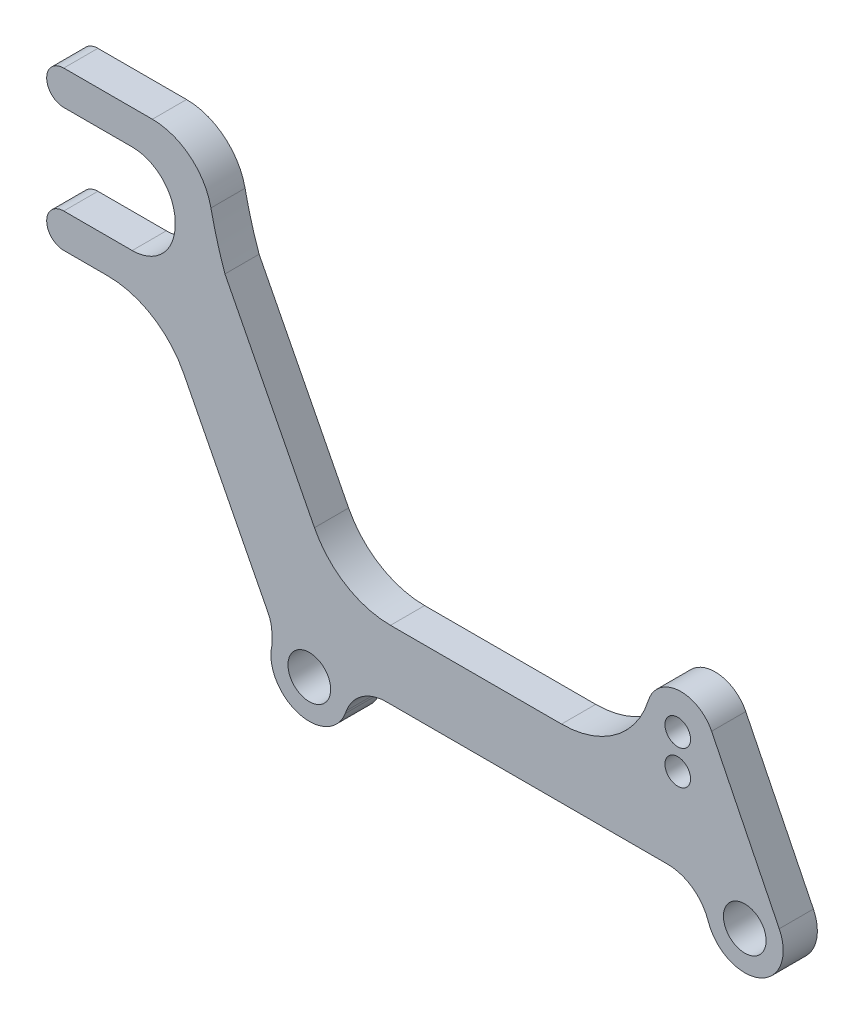
ISO-10303-21;
HEADER;
FILE_DESCRIPTION(('STEP AP214'),'2;1');
FILE_NAME('part.step','',(''),(''),'','','');
FILE_SCHEMA(('AUTOMOTIVE_DESIGN { 1 0 10303 214 1 1 1 1 }'));
ENDSEC;
DATA;
#1=APPLICATION_CONTEXT('core data for automotive mechanical design processes');
#2=APPLICATION_PROTOCOL_DEFINITION('international standard','automotive_design',2000,#1);
#3=PRODUCT_CONTEXT('',#1,'mechanical');
#4=PRODUCT('Part','Part','',(#3));
#5=PRODUCT_RELATED_PRODUCT_CATEGORY('part','',(#4));
#6=PRODUCT_DEFINITION_FORMATION('','',#4);
#7=PRODUCT_DEFINITION_CONTEXT('part definition',#1,'design');
#8=PRODUCT_DEFINITION('design','',#6,#7);
#9=PRODUCT_DEFINITION_SHAPE('','',#8);
#10=(LENGTH_UNIT() NAMED_UNIT(*) SI_UNIT(.MILLI.,.METRE.));
#11=(NAMED_UNIT(*) PLANE_ANGLE_UNIT() SI_UNIT($,.RADIAN.));
#12=(NAMED_UNIT(*) SI_UNIT($,.STERADIAN.) SOLID_ANGLE_UNIT());
#13=UNCERTAINTY_MEASURE_WITH_UNIT(LENGTH_MEASURE(1.E-05),#10,'distance_accuracy_value','');
#14=(GEOMETRIC_REPRESENTATION_CONTEXT(3) GLOBAL_UNCERTAINTY_ASSIGNED_CONTEXT((#13)) GLOBAL_UNIT_ASSIGNED_CONTEXT((#10,
#11,#12)) REPRESENTATION_CONTEXT('',''));
#15=CARTESIAN_POINT('',(0.,0.,0.));
#16=DIRECTION('',(0.,0.,1.));
#17=DIRECTION('',(1.,0.,0.));
#18=AXIS2_PLACEMENT_3D('',#15,#16,#17);
#19=CARTESIAN_POINT('',(-28.7601690496647,30.8915321938559,4.));
#20=DIRECTION('',(0.,0.,-1.));
#21=DIRECTION('',(-1.,0.,0.));
#22=AXIS2_PLACEMENT_3D('',#19,#20,#21);
#23=PLANE('',#22);
#24=CARTESIAN_POINT('',(-28.7601690496647,30.8915321938559,4.));
#25=DIRECTION('',(0.,0.,1.));
#26=DIRECTION('',(-1.,0.,0.));
#27=AXIS2_PLACEMENT_3D('',#24,#25,#26);
#28=CIRCLE('',#27,2.);
#29=CARTESIAN_POINT('',(-28.7601690496647,32.8915321938559,4.));
#30=VERTEX_POINT('',#29);
#31=CARTESIAN_POINT('',(-28.7601690496647,28.8915321938559,4.));
#32=VERTEX_POINT('',#31);
#33=EDGE_CURVE('E346',#30,#32,#28,.T.);
#34=ORIENTED_EDGE('',*,*,#33,.T.);
#35=DIRECTION('',(1.,0.,0.));
#36=VECTOR('',#35,1.);
#37=CARTESIAN_POINT('',(-23.6225518799133,28.8915321938559,4.));
#38=LINE('',#37,#36);
#39=CARTESIAN_POINT('',(-23.6225518799133,28.8915321938559,4.));
#40=VERTEX_POINT('',#39);
#41=EDGE_CURVE('E158',#32,#40,#38,.T.);
#42=ORIENTED_EDGE('',*,*,#41,.T.);
#43=CARTESIAN_POINT('',(-23.6225518799133,18.8915321938559,4.));
#44=DIRECTION('',(0.,0.,-1.));
#45=DIRECTION('',(1.,0.,0.));
#46=AXIS2_PLACEMENT_3D('',#43,#44,#45);
#47=CIRCLE('',#46,10.);
#48=CARTESIAN_POINT('',(-14.7192364122799,23.4446600949586,4.));
#49=VERTEX_POINT('',#48);
#50=EDGE_CURVE('E447',#40,#49,#47,.T.);
#51=ORIENTED_EDGE('',*,*,#50,.T.);
#52=DIRECTION('',(0.45531279011027,-0.89033154676334,0.));
#53=VECTOR('',#52,1.);
#54=CARTESIAN_POINT('',(-4.8233964576222,4.09405390790407,4.));
#55=LINE('',#54,#53);
#56=CARTESIAN_POINT('',(-4.8233964576222,4.09405390790407,4.));
#57=VERTEX_POINT('',#56);
#58=EDGE_CURVE('E465',#49,#57,#55,.T.);
#59=ORIENTED_EDGE('',*,*,#58,.T.);
#60=CARTESIAN_POINT('',(-8.38472264467556,2.27280274746299,4.));
#61=DIRECTION('',(0.,0.,-1.));
#62=DIRECTION('',(1.,0.,0.));
#63=AXIS2_PLACEMENT_3D('',#60,#61,#62);
#64=CIRCLE('',#63,4.);
#65=CARTESIAN_POINT('',(-4.38472423959174,2.26923072746274,4.));
#66=VERTEX_POINT('',#65);
#67=EDGE_CURVE('E461',#57,#66,#64,.T.);
#68=ORIENTED_EDGE('',*,*,#67,.T.);
#69=DIRECTION('',(-0.000893005000062703,-0.999999601270956,0.));
#70=VECTOR('',#69,1.);
#71=CARTESIAN_POINT('',(-4.38585130340636,1.00712876257641,4.));
#72=LINE('',#71,#70);
#73=CARTESIAN_POINT('',(-4.38585130340636,1.00712876257641,4.));
#74=VERTEX_POINT('',#73);
#75=EDGE_CURVE('E464',#66,#74,#72,.T.);
#76=ORIENTED_EDGE('',*,*,#75,.T.);
#77=CARTESIAN_POINT('',(0.,0.,4.));
#78=DIRECTION('',(0.,0.,1.));
#79=DIRECTION('',(1.,0.,0.));
#80=AXIS2_PLACEMENT_3D('',#77,#78,#79);
#81=CIRCLE('',#80,4.5);
#82=CARTESIAN_POINT('',(4.21059890776587,-1.58772064227963,4.));
#83=VERTEX_POINT('',#82);
#84=EDGE_CURVE('E469',#74,#83,#81,.T.);
#85=ORIENTED_EDGE('',*,*,#84,.T.);
#86=DIRECTION('',(0.352826809395516,0.935688646170178,0.));
#87=VECTOR('',#86,1.);
#88=CARTESIAN_POINT('',(4.34327527173537,-1.23586595302264,4.));
#89=LINE('',#88,#87);
#90=CARTESIAN_POINT('',(4.34327527173537,-1.23586595302264,4.));
#91=VERTEX_POINT('',#90);
#92=EDGE_CURVE('E476',#83,#91,#89,.T.);
#93=ORIENTED_EDGE('',*,*,#92,.T.);
#94=CARTESIAN_POINT('',(9.02171850258634,-3.,4.));
#95=DIRECTION('',(0.,0.,-1.));
#96=DIRECTION('',(-1.,0.,0.));
#97=AXIS2_PLACEMENT_3D('',#94,#95,#96);
#98=CIRCLE('',#97,5.);
#99=CARTESIAN_POINT('',(9.02171850258634,2.,4.));
#100=VERTEX_POINT('',#99);
#101=EDGE_CURVE('E479',#91,#100,#98,.T.);
#102=ORIENTED_EDGE('',*,*,#101,.T.);
#103=DIRECTION('',(1.,0.,0.));
#104=VECTOR('',#103,1.);
#105=CARTESIAN_POINT('',(9.02171850258634,2.,4.));
#106=LINE('',#105,#104);
#107=CARTESIAN_POINT('',(41.9782814974137,2.,4.));
#108=VERTEX_POINT('',#107);
#109=EDGE_CURVE('E482',#100,#108,#106,.T.);
#110=ORIENTED_EDGE('',*,*,#109,.T.);
#111=CARTESIAN_POINT('',(41.9782814974137,-3.,4.));
#112=DIRECTION('',(0.,0.,-1.));
#113=DIRECTION('',(1.,0.,0.));
#114=AXIS2_PLACEMENT_3D('',#111,#112,#113);
#115=CIRCLE('',#114,5.);
#116=CARTESIAN_POINT('',(46.6567247282646,-1.23586595302264,4.));
#117=VERTEX_POINT('',#116);
#118=EDGE_CURVE('E485',#108,#117,#115,.T.);
#119=ORIENTED_EDGE('',*,*,#118,.T.);
#120=DIRECTION('',(0.352826809395504,-0.935688646170182,0.));
#121=VECTOR('',#120,1.);
#122=CARTESIAN_POINT('',(46.6567247282646,-1.23586595302264,4.));
#123=LINE('',#122,#121);
#124=CARTESIAN_POINT('',(46.7894010922341,-1.58772064227962,4.));
#125=VERTEX_POINT('',#124);
#126=EDGE_CURVE('E488',#117,#125,#123,.T.);
#127=ORIENTED_EDGE('',*,*,#126,.T.);
#128=CARTESIAN_POINT('',(51.,0.,4.));
#129=DIRECTION('',(0.,0.,1.));
#130=DIRECTION('',(1.,0.,0.));
#131=AXIS2_PLACEMENT_3D('',#128,#129,#130);
#132=CIRCLE('',#131,4.5);
#133=CARTESIAN_POINT('',(55.0363571881557,1.98942721646799,4.));
#134=VERTEX_POINT('',#133);
#135=EDGE_CURVE('E491',#125,#134,#132,.T.);
#136=ORIENTED_EDGE('',*,*,#135,.T.);
#137=DIRECTION('',(-0.442094936992887,0.896968264034606,0.));
#138=VECTOR('',#137,1.);
#139=CARTESIAN_POINT('',(47.115238631423,18.0606177380623,4.));
#140=LINE('',#139,#138);
#141=CARTESIAN_POINT('',(47.115238631423,18.0606177380623,4.));
#142=VERTEX_POINT('',#141);
#143=EDGE_CURVE('E494',#134,#142,#140,.T.);
#144=ORIENTED_EDGE('',*,*,#143,.T.);
#145=CARTESIAN_POINT('',(43.5273655752845,16.2922379900907,4.));
#146=DIRECTION('',(0.,0.,1.));
#147=DIRECTION('',(1.,0.,0.));
#148=AXIS2_PLACEMENT_3D('',#145,#146,#147);
#149=CIRCLE('',#148,3.99999999999999);
#150=CARTESIAN_POINT('',(39.7088396838727,17.4833970964311,4.));
#151=VERTEX_POINT('',#150);
#152=EDGE_CURVE('E497',#142,#151,#149,.T.);
#153=ORIENTED_EDGE('',*,*,#152,.T.);
#154=CARTESIAN_POINT('',(29.5382911342049,20.6560196910981,4.));
#155=DIRECTION('',(0.,0.,-1.));
#156=DIRECTION('',(-1.,0.,0.));
#157=AXIS2_PLACEMENT_3D('',#154,#155,#156);
#158=CIRCLE('',#157,10.6539003153465);
#159=CARTESIAN_POINT('',(29.5382911342049,10.0021193757516,4.));
#160=VERTEX_POINT('',#159);
#161=EDGE_CURVE('E500',#151,#160,#158,.T.);
#162=ORIENTED_EDGE('',*,*,#161,.T.);
#163=DIRECTION('',(-1.,0.,0.));
#164=VECTOR('',#163,1.);
#165=CARTESIAN_POINT('',(9.50481012222218,10.0021193757516,4.));
#166=LINE('',#165,#164);
#167=CARTESIAN_POINT('',(9.50481012222218,10.0021193757516,4.));
#168=VERTEX_POINT('',#167);
#169=EDGE_CURVE('E503',#160,#168,#166,.T.);
#170=ORIENTED_EDGE('',*,*,#169,.T.);
#171=CARTESIAN_POINT('',(9.50481012222218,20.0021193757516,4.));
#172=DIRECTION('',(0.,0.,-1.));
#173=DIRECTION('',(-1.,0.,0.));
#174=AXIS2_PLACEMENT_3D('',#171,#172,#173);
#175=CIRCLE('',#174,10.);
#176=CARTESIAN_POINT('',(0.601494654588787,15.4489914746489,4.));
#177=VERTEX_POINT('',#176);
#178=EDGE_CURVE('E506',#168,#177,#175,.T.);
#179=ORIENTED_EDGE('',*,*,#178,.T.);
#180=DIRECTION('',(-0.45531279011027,0.89033154676334,0.));
#181=VECTOR('',#180,1.);
#182=CARTESIAN_POINT('',(0.601494654588783,15.4489914746489,4.));
#183=LINE('',#182,#181);
#184=CARTESIAN_POINT('',(-9.8806455276329,35.9460657597077,4.));
#185=VERTEX_POINT('',#184);
#186=EDGE_CURVE('E509',#177,#185,#183,.T.);
#187=ORIENTED_EDGE('',*,*,#186,.T.);
#188=CARTESIAN_POINT('',(32.5318339391936,50.9854003685269,4.));
#189=DIRECTION('',(0.,0.,-1.));
#190=DIRECTION('',(-1.,0.,0.));
#191=AXIS2_PLACEMENT_3D('',#188,#189,#190);
#192=CIRCLE('',#191,45.);
#193=CARTESIAN_POINT('',(-11.5244026613539,41.8176298327539,4.));
#194=VERTEX_POINT('',#193);
#195=EDGE_CURVE('E512',#185,#194,#192,.T.);
#196=ORIENTED_EDGE('',*,*,#195,.T.);
#197=CARTESIAN_POINT('',(-18.377595021439,40.3915321938559,4.));
#198=DIRECTION('',(0.,0.,1.));
#199=DIRECTION('',(1.,0.,0.));
#200=AXIS2_PLACEMENT_3D('',#197,#198,#199);
#201=CIRCLE('',#200,7.00000000000001);
#202=CARTESIAN_POINT('',(-18.377595021439,47.3915321938559,4.));
#203=VERTEX_POINT('',#202);
#204=EDGE_CURVE('E515',#194,#203,#201,.T.);
#205=ORIENTED_EDGE('',*,*,#204,.T.);
#206=DIRECTION('',(-1.,0.,0.));
#207=VECTOR('',#206,1.);
#208=CARTESIAN_POINT('',(-28.7601690496647,47.3915321938559,4.));
#209=LINE('',#208,#207);
#210=CARTESIAN_POINT('',(-28.7601690496647,47.3915321938559,4.));
#211=VERTEX_POINT('',#210);
#212=EDGE_CURVE('E518',#203,#211,#209,.T.);
#213=ORIENTED_EDGE('',*,*,#212,.T.);
#214=CARTESIAN_POINT('',(-28.7601690496647,45.3915321938559,4.));
#215=DIRECTION('',(0.,0.,1.));
#216=DIRECTION('',(1.,0.,0.));
#217=AXIS2_PLACEMENT_3D('',#214,#215,#216);
#218=CIRCLE('',#217,2.);
#219=CARTESIAN_POINT('',(-28.7601690496647,43.3915321938559,4.));
#220=VERTEX_POINT('',#219);
#221=EDGE_CURVE('E521',#211,#220,#218,.T.);
#222=ORIENTED_EDGE('',*,*,#221,.T.);
#223=DIRECTION('',(1.,0.,0.));
#224=VECTOR('',#223,1.);
#225=CARTESIAN_POINT('',(-28.7601690496647,43.3915321938559,4.));
#226=LINE('',#225,#224);
#227=CARTESIAN_POINT('',(-20.7437700690666,43.3915321938559,4.));
#228=VERTEX_POINT('',#227);
#229=EDGE_CURVE('E524',#220,#228,#226,.T.);
#230=ORIENTED_EDGE('',*,*,#229,.T.);
#231=CARTESIAN_POINT('',(-20.7437700690666,38.3915321938559,4.));
#232=DIRECTION('',(0.,0.,-1.));
#233=DIRECTION('',(-1.,0.,0.));
#234=AXIS2_PLACEMENT_3D('',#231,#232,#233);
#235=CIRCLE('',#234,4.99999999999999);
#236=CARTESIAN_POINT('',(-16.0925077672706,40.2261326952979,4.));
#237=VERTEX_POINT('',#236);
#238=EDGE_CURVE('E238',#228,#237,#235,.T.);
#239=ORIENTED_EDGE('',*,*,#238,.T.);
#240=CARTESIAN_POINT('',(-21.377595021439,38.1415321938559,4.));
#241=DIRECTION('',(0.,0.,-1.));
#242=DIRECTION('',(-1.,0.,0.));
#243=AXIS2_PLACEMENT_3D('',#240,#241,#242);
#244=CIRCLE('',#243,5.68134724645359);
#245=CARTESIAN_POINT('',(-16.0925077672706,36.0569316924139,4.));
#246=VERTEX_POINT('',#245);
#247=EDGE_CURVE('E231',#237,#246,#244,.T.);
#248=ORIENTED_EDGE('',*,*,#247,.T.);
#249=CARTESIAN_POINT('',(-20.7437700690666,37.8915321938559,4.));
#250=DIRECTION('',(0.,0.,-1.));
#251=DIRECTION('',(-1.,0.,0.));
#252=AXIS2_PLACEMENT_3D('',#249,#250,#251);
#253=CIRCLE('',#252,4.99999999999999);
#254=CARTESIAN_POINT('',(-20.7437700690666,32.8915321938559,4.));
#255=VERTEX_POINT('',#254);
#256=EDGE_CURVE('E235',#246,#255,#253,.T.);
#257=ORIENTED_EDGE('',*,*,#256,.T.);
#258=DIRECTION('',(-1.,0.,0.));
#259=VECTOR('',#258,1.);
#260=CARTESIAN_POINT('',(-23.6225518799133,32.8915321938559,4.));
#261=LINE('',#260,#259);
#262=EDGE_CURVE('E57',#255,#30,#261,.T.);
#263=ORIENTED_EDGE('',*,*,#262,.T.);
#264=EDGE_LOOP('',(#34,#42,#51,#59,#68,#76,#85,#93,#102,#110,#119,#127,#136,#144,#153,#162,#170,
#179,#187,#196,#205,#213,#222,#230,#239,#248,#257,#263));
#265=FACE_BOUND('',#264,.T.);
#266=CARTESIAN_POINT('',(0.,0.,4.));
#267=DIRECTION('',(0.,0.,1.));
#268=DIRECTION('',(1.,0.,0.));
#269=AXIS2_PLACEMENT_3D('',#266,#267,#268);
#270=CIRCLE('',#269,2.5);
#271=CARTESIAN_POINT('',(2.5,0.,4.));
#272=VERTEX_POINT('',#271);
#273=EDGE_CURVE('E267',#272,#272,#270,.T.);
#274=ORIENTED_EDGE('',*,*,#273,.F.);
#275=EDGE_LOOP('',(#274));
#276=FACE_BOUND('',#275,.T.);
#277=CARTESIAN_POINT('',(51.,0.,4.));
#278=DIRECTION('',(0.,0.,1.));
#279=DIRECTION('',(1.,0.,0.));
#280=AXIS2_PLACEMENT_3D('',#277,#278,#279);
#281=CIRCLE('',#280,2.49999999999999);
#282=CARTESIAN_POINT('',(53.5,0.,4.));
#283=VERTEX_POINT('',#282);
#284=EDGE_CURVE('E551',#283,#283,#281,.T.);
#285=ORIENTED_EDGE('',*,*,#284,.F.);
#286=EDGE_LOOP('',(#285));
#287=FACE_BOUND('',#286,.T.);
#288=CARTESIAN_POINT('',(43.1502366089124,12.,4.));
#289=DIRECTION('',(0.,0.,1.));
#290=DIRECTION('',(1.,0.,0.));
#291=AXIS2_PLACEMENT_3D('',#288,#289,#290);
#292=CIRCLE('',#291,1.5);
#293=CARTESIAN_POINT('',(44.6502366089124,12.,4.));
#294=VERTEX_POINT('',#293);
#295=EDGE_CURVE('E559',#294,#294,#292,.T.);
#296=ORIENTED_EDGE('',*,*,#295,.F.);
#297=EDGE_LOOP('',(#296));
#298=FACE_BOUND('',#297,.T.);
#299=CARTESIAN_POINT('',(43.1502366089124,16.,4.));
#300=DIRECTION('',(0.,0.,1.));
#301=DIRECTION('',(1.,0.,0.));
#302=AXIS2_PLACEMENT_3D('',#299,#300,#301);
#303=CIRCLE('',#302,1.5);
#304=CARTESIAN_POINT('',(44.6502366089124,16.,4.));
#305=VERTEX_POINT('',#304);
#306=EDGE_CURVE('E567',#305,#305,#303,.T.);
#307=ORIENTED_EDGE('',*,*,#306,.F.);
#308=EDGE_LOOP('',(#307));
#309=FACE_BOUND('',#308,.T.);
#310=ADVANCED_FACE('F39',(#265,#276,#287,#298,#309),#23,.F.);
#311=CARTESIAN_POINT('',(-28.7601690496647,30.8915321938559,0.));
#312=DIRECTION('',(0.,0.,-1.));
#313=DIRECTION('',(-1.,0.,0.));
#314=AXIS2_PLACEMENT_3D('',#311,#312,#313);
#315=PLANE('',#314);
#316=CARTESIAN_POINT('',(43.1502366089124,12.,0.));
#317=DIRECTION('',(0.,0.,1.));
#318=DIRECTION('',(1.,0.,0.));
#319=AXIS2_PLACEMENT_3D('',#316,#317,#318);
#320=CIRCLE('',#319,1.5);
#321=CARTESIAN_POINT('',(44.6502366089124,12.,0.));
#322=VERTEX_POINT('',#321);
#323=EDGE_CURVE('E563',#322,#322,#320,.T.);
#324=ORIENTED_EDGE('',*,*,#323,.T.);
#325=EDGE_LOOP('',(#324));
#326=FACE_BOUND('',#325,.T.);
#327=CARTESIAN_POINT('',(0.,0.,0.));
#328=DIRECTION('',(0.,0.,1.));
#329=DIRECTION('',(1.,0.,0.));
#330=AXIS2_PLACEMENT_3D('',#327,#328,#329);
#331=CIRCLE('',#330,2.5);
#332=CARTESIAN_POINT('',(2.5,0.,0.));
#333=VERTEX_POINT('',#332);
#334=EDGE_CURVE('E546',#333,#333,#331,.T.);
#335=ORIENTED_EDGE('',*,*,#334,.T.);
#336=EDGE_LOOP('',(#335));
#337=FACE_BOUND('',#336,.T.);
#338=CARTESIAN_POINT('',(-28.7601690496647,30.8915321938559,0.));
#339=DIRECTION('',(0.,0.,1.));
#340=DIRECTION('',(-1.,0.,0.));
#341=AXIS2_PLACEMENT_3D('',#338,#339,#340);
#342=CIRCLE('',#341,2.);
#343=CARTESIAN_POINT('',(-28.7601690496647,32.8915321938559,0.));
#344=VERTEX_POINT('',#343);
#345=CARTESIAN_POINT('',(-28.7601690496647,28.8915321938559,0.));
#346=VERTEX_POINT('',#345);
#347=EDGE_CURVE('E262',#344,#346,#342,.T.);
#348=ORIENTED_EDGE('',*,*,#347,.F.);
#349=DIRECTION('',(-1.,0.,0.));
#350=VECTOR('',#349,1.);
#351=CARTESIAN_POINT('',(-23.6225518799133,32.8915321938559,0.));
#352=LINE('',#351,#350);
#353=CARTESIAN_POINT('',(-20.7437700690666,32.8915321938559,0.));
#354=VERTEX_POINT('',#353);
#355=EDGE_CURVE('E146',#354,#344,#352,.T.);
#356=ORIENTED_EDGE('',*,*,#355,.F.);
#357=CARTESIAN_POINT('',(-20.7437700690666,37.8915321938559,0.));
#358=DIRECTION('',(0.,0.,-1.));
#359=DIRECTION('',(-1.,0.,0.));
#360=AXIS2_PLACEMENT_3D('',#357,#358,#359);
#361=CIRCLE('',#360,4.99999999999999);
#362=CARTESIAN_POINT('',(-16.0925077672706,36.0569316924139,0.));
#363=VERTEX_POINT('',#362);
#364=EDGE_CURVE('E341',#363,#354,#361,.T.);
#365=ORIENTED_EDGE('',*,*,#364,.F.);
#366=CARTESIAN_POINT('',(-21.377595021439,38.1415321938559,0.));
#367=DIRECTION('',(0.,0.,-1.));
#368=DIRECTION('',(-1.,0.,0.));
#369=AXIS2_PLACEMENT_3D('',#366,#367,#368);
#370=CIRCLE('',#369,5.68134724645359);
#371=CARTESIAN_POINT('',(-16.0925077672706,40.2261326952979,0.));
#372=VERTEX_POINT('',#371);
#373=EDGE_CURVE('E248',#372,#363,#370,.T.);
#374=ORIENTED_EDGE('',*,*,#373,.F.);
#375=CARTESIAN_POINT('',(-20.7437700690666,38.3915321938559,0.));
#376=DIRECTION('',(0.,0.,-1.));
#377=DIRECTION('',(-1.,0.,0.));
#378=AXIS2_PLACEMENT_3D('',#375,#376,#377);
#379=CIRCLE('',#378,4.99999999999999);
#380=CARTESIAN_POINT('',(-20.7437700690666,43.3915321938559,0.));
#381=VERTEX_POINT('',#380);
#382=EDGE_CURVE('E336',#381,#372,#379,.T.);
#383=ORIENTED_EDGE('',*,*,#382,.F.);
#384=DIRECTION('',(1.,0.,0.));
#385=VECTOR('',#384,1.);
#386=CARTESIAN_POINT('',(-28.7601690496647,43.3915321938559,0.));
#387=LINE('',#386,#385);
#388=CARTESIAN_POINT('',(-28.7601690496647,43.3915321938559,0.));
#389=VERTEX_POINT('',#388);
#390=EDGE_CURVE('E333',#389,#381,#387,.T.);
#391=ORIENTED_EDGE('',*,*,#390,.F.);
#392=CARTESIAN_POINT('',(-28.7601690496647,45.3915321938559,0.));
#393=DIRECTION('',(0.,0.,1.));
#394=DIRECTION('',(1.,0.,0.));
#395=AXIS2_PLACEMENT_3D('',#392,#393,#394);
#396=CIRCLE('',#395,2.);
#397=CARTESIAN_POINT('',(-28.7601690496647,47.3915321938559,0.));
#398=VERTEX_POINT('',#397);
#399=EDGE_CURVE('E330',#398,#389,#396,.T.);
#400=ORIENTED_EDGE('',*,*,#399,.F.);
#401=DIRECTION('',(-1.,0.,0.));
#402=VECTOR('',#401,1.);
#403=CARTESIAN_POINT('',(-28.7601690496647,47.3915321938559,0.));
#404=LINE('',#403,#402);
#405=CARTESIAN_POINT('',(-18.377595021439,47.3915321938559,0.));
#406=VERTEX_POINT('',#405);
#407=EDGE_CURVE('E327',#406,#398,#404,.T.);
#408=ORIENTED_EDGE('',*,*,#407,.F.);
#409=CARTESIAN_POINT('',(-18.377595021439,40.3915321938559,0.));
#410=DIRECTION('',(0.,0.,1.));
#411=DIRECTION('',(1.,0.,0.));
#412=AXIS2_PLACEMENT_3D('',#409,#410,#411);
#413=CIRCLE('',#412,7.00000000000001);
#414=CARTESIAN_POINT('',(-11.5244026613539,41.8176298327539,0.));
#415=VERTEX_POINT('',#414);
#416=EDGE_CURVE('E324',#415,#406,#413,.T.);
#417=ORIENTED_EDGE('',*,*,#416,.F.);
#418=CARTESIAN_POINT('',(32.5318339391936,50.9854003685269,0.));
#419=DIRECTION('',(0.,0.,-1.));
#420=DIRECTION('',(-1.,0.,0.));
#421=AXIS2_PLACEMENT_3D('',#418,#419,#420);
#422=CIRCLE('',#421,45.);
#423=CARTESIAN_POINT('',(-9.8806455276329,35.9460657597077,0.));
#424=VERTEX_POINT('',#423);
#425=EDGE_CURVE('E321',#424,#415,#422,.T.);
#426=ORIENTED_EDGE('',*,*,#425,.F.);
#427=DIRECTION('',(-0.45531279011027,0.89033154676334,0.));
#428=VECTOR('',#427,1.);
#429=CARTESIAN_POINT('',(0.601494654588783,15.4489914746489,0.));
#430=LINE('',#429,#428);
#431=CARTESIAN_POINT('',(0.601494654588787,15.4489914746489,0.));
#432=VERTEX_POINT('',#431);
#433=EDGE_CURVE('E318',#432,#424,#430,.T.);
#434=ORIENTED_EDGE('',*,*,#433,.F.);
#435=CARTESIAN_POINT('',(9.50481012222218,20.0021193757516,0.));
#436=DIRECTION('',(0.,0.,-1.));
#437=DIRECTION('',(-1.,0.,0.));
#438=AXIS2_PLACEMENT_3D('',#435,#436,#437);
#439=CIRCLE('',#438,10.);
#440=CARTESIAN_POINT('',(9.50481012222218,10.0021193757516,0.));
#441=VERTEX_POINT('',#440);
#442=EDGE_CURVE('E315',#441,#432,#439,.T.);
#443=ORIENTED_EDGE('',*,*,#442,.F.);
#444=DIRECTION('',(-1.,0.,0.));
#445=VECTOR('',#444,1.);
#446=CARTESIAN_POINT('',(9.50481012222218,10.0021193757516,0.));
#447=LINE('',#446,#445);
#448=CARTESIAN_POINT('',(29.5382911342049,10.0021193757516,0.));
#449=VERTEX_POINT('',#448);
#450=EDGE_CURVE('E312',#449,#441,#447,.T.);
#451=ORIENTED_EDGE('',*,*,#450,.F.);
#452=CARTESIAN_POINT('',(29.5382911342049,20.6560196910981,0.));
#453=DIRECTION('',(0.,0.,-1.));
#454=DIRECTION('',(-1.,0.,0.));
#455=AXIS2_PLACEMENT_3D('',#452,#453,#454);
#456=CIRCLE('',#455,10.6539003153465);
#457=CARTESIAN_POINT('',(39.7088396838727,17.4833970964311,0.));
#458=VERTEX_POINT('',#457);
#459=EDGE_CURVE('E309',#458,#449,#456,.T.);
#460=ORIENTED_EDGE('',*,*,#459,.F.);
#461=CARTESIAN_POINT('',(43.5273655752845,16.2922379900907,0.));
#462=DIRECTION('',(0.,0.,1.));
#463=DIRECTION('',(1.,0.,0.));
#464=AXIS2_PLACEMENT_3D('',#461,#462,#463);
#465=CIRCLE('',#464,3.99999999999999);
#466=CARTESIAN_POINT('',(47.115238631423,18.0606177380623,0.));
#467=VERTEX_POINT('',#466);
#468=EDGE_CURVE('E306',#467,#458,#465,.T.);
#469=ORIENTED_EDGE('',*,*,#468,.F.);
#470=DIRECTION('',(-0.442094936992887,0.896968264034606,0.));
#471=VECTOR('',#470,1.);
#472=CARTESIAN_POINT('',(47.115238631423,18.0606177380623,0.));
#473=LINE('',#472,#471);
#474=CARTESIAN_POINT('',(55.0363571881557,1.98942721646799,0.));
#475=VERTEX_POINT('',#474);
#476=EDGE_CURVE('E303',#475,#467,#473,.T.);
#477=ORIENTED_EDGE('',*,*,#476,.F.);
#478=CARTESIAN_POINT('',(51.,0.,0.));
#479=DIRECTION('',(0.,0.,1.));
#480=DIRECTION('',(1.,0.,0.));
#481=AXIS2_PLACEMENT_3D('',#478,#479,#480);
#482=CIRCLE('',#481,4.5);
#483=CARTESIAN_POINT('',(46.7894010922341,-1.58772064227962,0.));
#484=VERTEX_POINT('',#483);
#485=EDGE_CURVE('E300',#484,#475,#482,.T.);
#486=ORIENTED_EDGE('',*,*,#485,.F.);
#487=DIRECTION('',(0.352826809395504,-0.935688646170182,0.));
#488=VECTOR('',#487,1.);
#489=CARTESIAN_POINT('',(46.6567247282646,-1.23586595302264,0.));
#490=LINE('',#489,#488);
#491=CARTESIAN_POINT('',(46.6567247282646,-1.23586595302264,0.));
#492=VERTEX_POINT('',#491);
#493=EDGE_CURVE('E297',#492,#484,#490,.T.);
#494=ORIENTED_EDGE('',*,*,#493,.F.);
#495=CARTESIAN_POINT('',(41.9782814974137,-3.,0.));
#496=DIRECTION('',(0.,0.,-1.));
#497=DIRECTION('',(1.,0.,0.));
#498=AXIS2_PLACEMENT_3D('',#495,#496,#497);
#499=CIRCLE('',#498,5.);
#500=CARTESIAN_POINT('',(41.9782814974137,2.,0.));
#501=VERTEX_POINT('',#500);
#502=EDGE_CURVE('E294',#501,#492,#499,.T.);
#503=ORIENTED_EDGE('',*,*,#502,.F.);
#504=DIRECTION('',(1.,0.,0.));
#505=VECTOR('',#504,1.);
#506=CARTESIAN_POINT('',(9.02171850258634,2.,0.));
#507=LINE('',#506,#505);
#508=CARTESIAN_POINT('',(9.02171850258634,2.,0.));
#509=VERTEX_POINT('',#508);
#510=EDGE_CURVE('E291',#509,#501,#507,.T.);
#511=ORIENTED_EDGE('',*,*,#510,.F.);
#512=CARTESIAN_POINT('',(9.02171850258634,-3.,0.));
#513=DIRECTION('',(0.,0.,-1.));
#514=DIRECTION('',(-1.,0.,0.));
#515=AXIS2_PLACEMENT_3D('',#512,#513,#514);
#516=CIRCLE('',#515,5.);
#517=CARTESIAN_POINT('',(4.34327527173537,-1.23586595302264,0.));
#518=VERTEX_POINT('',#517);
#519=EDGE_CURVE('E288',#518,#509,#516,.T.);
#520=ORIENTED_EDGE('',*,*,#519,.F.);
#521=DIRECTION('',(0.352826809395516,0.935688646170178,0.));
#522=VECTOR('',#521,1.);
#523=CARTESIAN_POINT('',(4.34327527173537,-1.23586595302264,0.));
#524=LINE('',#523,#522);
#525=CARTESIAN_POINT('',(4.21059890776587,-1.58772064227963,0.));
#526=VERTEX_POINT('',#525);
#527=EDGE_CURVE('E285',#526,#518,#524,.T.);
#528=ORIENTED_EDGE('',*,*,#527,.F.);
#529=CARTESIAN_POINT('',(0.,0.,0.));
#530=DIRECTION('',(0.,0.,1.));
#531=DIRECTION('',(1.,0.,0.));
#532=AXIS2_PLACEMENT_3D('',#529,#530,#531);
#533=CIRCLE('',#532,4.5);
#534=CARTESIAN_POINT('',(-4.38585130340636,1.00712876257641,0.));
#535=VERTEX_POINT('',#534);
#536=EDGE_CURVE('E282',#535,#526,#533,.T.);
#537=ORIENTED_EDGE('',*,*,#536,.F.);
#538=DIRECTION('',(-0.000893005000062703,-0.999999601270956,0.));
#539=VECTOR('',#538,1.);
#540=CARTESIAN_POINT('',(-4.38585130340636,1.00712876257641,0.));
#541=LINE('',#540,#539);
#542=CARTESIAN_POINT('',(-4.38472423959174,2.26923072746274,0.));
#543=VERTEX_POINT('',#542);
#544=EDGE_CURVE('E279',#543,#535,#541,.T.);
#545=ORIENTED_EDGE('',*,*,#544,.F.);
#546=CARTESIAN_POINT('',(-8.38472264467556,2.27280274746299,0.));
#547=DIRECTION('',(0.,0.,-1.));
#548=DIRECTION('',(1.,0.,0.));
#549=AXIS2_PLACEMENT_3D('',#546,#547,#548);
#550=CIRCLE('',#549,4.);
#551=CARTESIAN_POINT('',(-4.8233964576222,4.09405390790407,0.));
#552=VERTEX_POINT('',#551);
#553=EDGE_CURVE('E276',#552,#543,#550,.T.);
#554=ORIENTED_EDGE('',*,*,#553,.F.);
#555=DIRECTION('',(0.45531279011027,-0.89033154676334,0.));
#556=VECTOR('',#555,1.);
#557=CARTESIAN_POINT('',(-4.8233964576222,4.09405390790407,0.));
#558=LINE('',#557,#556);
#559=CARTESIAN_POINT('',(-14.7192364122799,23.4446600949586,0.));
#560=VERTEX_POINT('',#559);
#561=EDGE_CURVE('E273',#560,#552,#558,.T.);
#562=ORIENTED_EDGE('',*,*,#561,.F.);
#563=CARTESIAN_POINT('',(-23.6225518799133,18.8915321938559,0.));
#564=DIRECTION('',(0.,0.,-1.));
#565=DIRECTION('',(1.,0.,0.));
#566=AXIS2_PLACEMENT_3D('',#563,#564,#565);
#567=CIRCLE('',#566,10.);
#568=CARTESIAN_POINT('',(-23.6225518799133,28.8915321938559,0.));
#569=VERTEX_POINT('',#568);
#570=EDGE_CURVE('E270',#569,#560,#567,.T.);
#571=ORIENTED_EDGE('',*,*,#570,.F.);
#572=DIRECTION('',(1.,0.,0.));
#573=VECTOR('',#572,1.);
#574=CARTESIAN_POINT('',(-23.6225518799133,28.8915321938559,0.));
#575=LINE('',#574,#573);
#576=EDGE_CURVE('E266',#346,#569,#575,.T.);
#577=ORIENTED_EDGE('',*,*,#576,.F.);
#578=EDGE_LOOP('',(#348,#356,#365,#374,#383,#391,#400,#408,#417,#426,#434,#443,#451,#460,#469,
#477,#486,#494,#503,#511,#520,#528,#537,#545,#554,#562,#571,#577));
#579=FACE_BOUND('',#578,.T.);
#580=CARTESIAN_POINT('',(51.,0.,0.));
#581=DIRECTION('',(0.,0.,1.));
#582=DIRECTION('',(1.,0.,0.));
#583=AXIS2_PLACEMENT_3D('',#580,#581,#582);
#584=CIRCLE('',#583,2.49999999999999);
#585=CARTESIAN_POINT('',(53.5,0.,0.));
#586=VERTEX_POINT('',#585);
#587=EDGE_CURVE('E555',#586,#586,#584,.T.);
#588=ORIENTED_EDGE('',*,*,#587,.T.);
#589=EDGE_LOOP('',(#588));
#590=FACE_BOUND('',#589,.T.);
#591=CARTESIAN_POINT('',(43.1502366089124,16.,0.));
#592=DIRECTION('',(0.,0.,1.));
#593=DIRECTION('',(1.,0.,0.));
#594=AXIS2_PLACEMENT_3D('',#591,#592,#593);
#595=CIRCLE('',#594,1.5);
#596=CARTESIAN_POINT('',(44.6502366089124,16.,0.));
#597=VERTEX_POINT('',#596);
#598=EDGE_CURVE('E571',#597,#597,#595,.T.);
#599=ORIENTED_EDGE('',*,*,#598,.T.);
#600=EDGE_LOOP('',(#599));
#601=FACE_BOUND('',#600,.T.);
#602=ADVANCED_FACE('F449',(#326,#337,#579,#590,#601),#315,.T.);
#603=CARTESIAN_POINT('',(-28.7601690496647,30.8915321938559,4.));
#604=DIRECTION('',(0.,0.,-1.));
#605=DIRECTION('',(-1.,0.,0.));
#606=AXIS2_PLACEMENT_3D('',#603,#604,#605);
#607=CYLINDRICAL_SURFACE('',#606,2.);
#608=ORIENTED_EDGE('',*,*,#347,.T.);
#609=DIRECTION('',(0.,0.,-1.));
#610=VECTOR('',#609,1.);
#611=CARTESIAN_POINT('',(-28.7601690496647,28.8915321938559,4.));
#612=LINE('',#611,#610);
#613=EDGE_CURVE('E11',#32,#346,#612,.T.);
#614=ORIENTED_EDGE('',*,*,#613,.F.);
#615=ORIENTED_EDGE('',*,*,#33,.F.);
#616=DIRECTION('',(0.,0.,-1.));
#617=VECTOR('',#616,1.);
#618=CARTESIAN_POINT('',(-28.7601690496647,32.8915321938559,4.));
#619=LINE('',#618,#617);
#620=EDGE_CURVE('E258',#30,#344,#619,.T.);
#621=ORIENTED_EDGE('',*,*,#620,.T.);
#622=EDGE_LOOP('',(#608,#614,#615,#621));
#623=FACE_BOUND('',#622,.T.);
#624=ADVANCED_FACE('F41',(#623),#607,.T.);
#625=CARTESIAN_POINT('',(-23.6225518799133,28.8915321938559,4.));
#626=DIRECTION('',(0.,1.,0.));
#627=DIRECTION('',(0.,0.,1.));
#628=AXIS2_PLACEMENT_3D('',#625,#626,#627);
#629=PLANE('',#628);
#630=ORIENTED_EDGE('',*,*,#576,.T.);
#631=DIRECTION('',(0.,0.,-1.));
#632=VECTOR('',#631,1.);
#633=CARTESIAN_POINT('',(-23.6225518799133,28.8915321938559,4.));
#634=LINE('',#633,#632);
#635=EDGE_CURVE('E49',#40,#569,#634,.T.);
#636=ORIENTED_EDGE('',*,*,#635,.F.);
#637=ORIENTED_EDGE('',*,*,#41,.F.);
#638=ORIENTED_EDGE('',*,*,#613,.T.);
#639=EDGE_LOOP('',(#630,#636,#637,#638));
#640=FACE_BOUND('',#639,.T.);
#641=ADVANCED_FACE('F680',(#640),#629,.F.);
#642=CARTESIAN_POINT('',(-23.6225518799133,18.8915321938559,4.));
#643=DIRECTION('',(0.,0.,-1.));
#644=DIRECTION('',(-1.,0.,0.));
#645=AXIS2_PLACEMENT_3D('',#642,#643,#644);
#646=CYLINDRICAL_SURFACE('',#645,10.);
#647=ORIENTED_EDGE('',*,*,#570,.T.);
#648=DIRECTION('',(0.,0.,-1.));
#649=VECTOR('',#648,1.);
#650=CARTESIAN_POINT('',(-14.7192364122799,23.4446600949586,4.));
#651=LINE('',#650,#649);
#652=EDGE_CURVE('E437',#49,#560,#651,.T.);
#653=ORIENTED_EDGE('',*,*,#652,.F.);
#654=ORIENTED_EDGE('',*,*,#50,.F.);
#655=ORIENTED_EDGE('',*,*,#635,.T.);
#656=EDGE_LOOP('',(#647,#653,#654,#655));
#657=FACE_BOUND('',#656,.T.);
#658=ADVANCED_FACE('F445',(#657),#646,.F.);
#659=CARTESIAN_POINT('',(-4.8233964576222,4.09405390790407,4.));
#660=DIRECTION('',(0.89033154676334,0.45531279011027,0.));
#661=DIRECTION('',(-0.45531279011027,0.89033154676334,0.));
#662=AXIS2_PLACEMENT_3D('',#659,#660,#661);
#663=PLANE('',#662);
#664=ORIENTED_EDGE('',*,*,#561,.T.);
#665=DIRECTION('',(0.,0.,-1.));
#666=VECTOR('',#665,1.);
#667=CARTESIAN_POINT('',(-4.8233964576222,4.09405390790407,4.));
#668=LINE('',#667,#666);
#669=EDGE_CURVE('E433',#57,#552,#668,.T.);
#670=ORIENTED_EDGE('',*,*,#669,.F.);
#671=ORIENTED_EDGE('',*,*,#58,.F.);
#672=ORIENTED_EDGE('',*,*,#652,.T.);
#673=EDGE_LOOP('',(#664,#670,#671,#672));
#674=FACE_BOUND('',#673,.T.);
#675=ADVANCED_FACE('F455',(#674),#663,.F.);
#676=CARTESIAN_POINT('',(-8.38472264467556,2.27280274746299,4.));
#677=DIRECTION('',(0.,0.,-1.));
#678=DIRECTION('',(-1.,0.,0.));
#679=AXIS2_PLACEMENT_3D('',#676,#677,#678);
#680=CYLINDRICAL_SURFACE('',#679,4.);
#681=ORIENTED_EDGE('',*,*,#553,.T.);
#682=DIRECTION('',(0.,0.,-1.));
#683=VECTOR('',#682,1.);
#684=CARTESIAN_POINT('',(-4.38472423959174,2.26923072746274,4.));
#685=LINE('',#684,#683);
#686=EDGE_CURVE('E429',#66,#543,#685,.T.);
#687=ORIENTED_EDGE('',*,*,#686,.F.);
#688=ORIENTED_EDGE('',*,*,#67,.F.);
#689=ORIENTED_EDGE('',*,*,#669,.T.);
#690=EDGE_LOOP('',(#681,#687,#688,#689));
#691=FACE_BOUND('',#690,.T.);
#692=ADVANCED_FACE('F459',(#691),#680,.F.);
#693=CARTESIAN_POINT('',(-4.38585130340636,1.00712876257641,4.));
#694=DIRECTION('',(0.999999601270955,-0.000893005000062703,0.));
#695=DIRECTION('',(0.000893005000062703,0.999999601270955,0.));
#696=AXIS2_PLACEMENT_3D('',#693,#694,#695);
#697=PLANE('',#696);
#698=ORIENTED_EDGE('',*,*,#544,.T.);
#699=DIRECTION('',(0.,0.,-1.));
#700=VECTOR('',#699,1.);
#701=CARTESIAN_POINT('',(-4.38585130340636,1.00712876257641,4.));
#702=LINE('',#701,#700);
#703=EDGE_CURVE('E425',#74,#535,#702,.T.);
#704=ORIENTED_EDGE('',*,*,#703,.F.);
#705=ORIENTED_EDGE('',*,*,#75,.F.);
#706=ORIENTED_EDGE('',*,*,#686,.T.);
#707=EDGE_LOOP('',(#698,#704,#705,#706));
#708=FACE_BOUND('',#707,.T.);
#709=ADVANCED_FACE('F670',(#708),#697,.F.);
#710=CARTESIAN_POINT('',(0.,0.,4.));
#711=DIRECTION('',(0.,0.,-1.));
#712=DIRECTION('',(-1.,0.,0.));
#713=AXIS2_PLACEMENT_3D('',#710,#711,#712);
#714=CYLINDRICAL_SURFACE('',#713,4.5);
#715=ORIENTED_EDGE('',*,*,#536,.T.);
#716=DIRECTION('',(0.,0.,-1.));
#717=VECTOR('',#716,1.);
#718=CARTESIAN_POINT('',(4.21059890776587,-1.58772064227963,4.));
#719=LINE('',#718,#717);
#720=EDGE_CURVE('E421',#83,#526,#719,.T.);
#721=ORIENTED_EDGE('',*,*,#720,.F.);
#722=ORIENTED_EDGE('',*,*,#84,.F.);
#723=ORIENTED_EDGE('',*,*,#703,.T.);
#724=EDGE_LOOP('',(#715,#721,#722,#723));
#725=FACE_BOUND('',#724,.T.);
#726=ADVANCED_FACE('F666',(#725),#714,.T.);
#727=CARTESIAN_POINT('',(4.34327527173537,-1.23586595302264,4.));
#728=DIRECTION('',(-0.935688646170178,0.352826809395516,0.));
#729=DIRECTION('',(-0.352826809395516,-0.935688646170178,0.));
#730=AXIS2_PLACEMENT_3D('',#727,#728,#729);
#731=PLANE('',#730);
#732=ORIENTED_EDGE('',*,*,#527,.T.);
#733=DIRECTION('',(0.,0.,-1.));
#734=VECTOR('',#733,1.);
#735=CARTESIAN_POINT('',(4.34327527173537,-1.23586595302264,4.));
#736=LINE('',#735,#734);
#737=EDGE_CURVE('E417',#91,#518,#736,.T.);
#738=ORIENTED_EDGE('',*,*,#737,.F.);
#739=ORIENTED_EDGE('',*,*,#92,.F.);
#740=ORIENTED_EDGE('',*,*,#720,.T.);
#741=EDGE_LOOP('',(#732,#738,#739,#740));
#742=FACE_BOUND('',#741,.T.);
#743=ADVANCED_FACE('F662',(#742),#731,.F.);
#744=CARTESIAN_POINT('',(9.02171850258634,-3.,4.));
#745=DIRECTION('',(0.,0.,-1.));
#746=DIRECTION('',(-1.,0.,0.));
#747=AXIS2_PLACEMENT_3D('',#744,#745,#746);
#748=CYLINDRICAL_SURFACE('',#747,5.);
#749=ORIENTED_EDGE('',*,*,#519,.T.);
#750=DIRECTION('',(0.,0.,-1.));
#751=VECTOR('',#750,1.);
#752=CARTESIAN_POINT('',(9.02171850258634,2.,4.));
#753=LINE('',#752,#751);
#754=EDGE_CURVE('E413',#100,#509,#753,.T.);
#755=ORIENTED_EDGE('',*,*,#754,.F.);
#756=ORIENTED_EDGE('',*,*,#101,.F.);
#757=ORIENTED_EDGE('',*,*,#737,.T.);
#758=EDGE_LOOP('',(#749,#755,#756,#757));
#759=FACE_BOUND('',#758,.T.);
#760=ADVANCED_FACE('F658',(#759),#748,.F.);
#761=CARTESIAN_POINT('',(9.02171850258634,2.,4.));
#762=DIRECTION('',(0.,1.,0.));
#763=DIRECTION('',(0.,0.,1.));
#764=AXIS2_PLACEMENT_3D('',#761,#762,#763);
#765=PLANE('',#764);
#766=ORIENTED_EDGE('',*,*,#510,.T.);
#767=DIRECTION('',(0.,0.,-1.));
#768=VECTOR('',#767,1.);
#769=CARTESIAN_POINT('',(41.9782814974137,2.,4.));
#770=LINE('',#769,#768);
#771=EDGE_CURVE('E409',#108,#501,#770,.T.);
#772=ORIENTED_EDGE('',*,*,#771,.F.);
#773=ORIENTED_EDGE('',*,*,#109,.F.);
#774=ORIENTED_EDGE('',*,*,#754,.T.);
#775=EDGE_LOOP('',(#766,#772,#773,#774));
#776=FACE_BOUND('',#775,.T.);
#777=ADVANCED_FACE('F654',(#776),#765,.F.);
#778=CARTESIAN_POINT('',(41.9782814974137,-3.,4.));
#779=DIRECTION('',(0.,0.,-1.));
#780=DIRECTION('',(-1.,0.,0.));
#781=AXIS2_PLACEMENT_3D('',#778,#779,#780);
#782=CYLINDRICAL_SURFACE('',#781,5.);
#783=ORIENTED_EDGE('',*,*,#502,.T.);
#784=DIRECTION('',(0.,0.,-1.));
#785=VECTOR('',#784,1.);
#786=CARTESIAN_POINT('',(46.6567247282646,-1.23586595302264,4.));
#787=LINE('',#786,#785);
#788=EDGE_CURVE('E405',#117,#492,#787,.T.);
#789=ORIENTED_EDGE('',*,*,#788,.F.);
#790=ORIENTED_EDGE('',*,*,#118,.F.);
#791=ORIENTED_EDGE('',*,*,#771,.T.);
#792=EDGE_LOOP('',(#783,#789,#790,#791));
#793=FACE_BOUND('',#792,.T.);
#794=ADVANCED_FACE('F650',(#793),#782,.F.);
#795=CARTESIAN_POINT('',(46.6567247282646,-1.23586595302264,4.));
#796=DIRECTION('',(0.935688646170182,0.352826809395504,0.));
#797=DIRECTION('',(-0.352826809395504,0.935688646170182,0.));
#798=AXIS2_PLACEMENT_3D('',#795,#796,#797);
#799=PLANE('',#798);
#800=ORIENTED_EDGE('',*,*,#493,.T.);
#801=DIRECTION('',(0.,0.,-1.));
#802=VECTOR('',#801,1.);
#803=CARTESIAN_POINT('',(46.7894010922341,-1.58772064227962,4.));
#804=LINE('',#803,#802);
#805=EDGE_CURVE('E401',#125,#484,#804,.T.);
#806=ORIENTED_EDGE('',*,*,#805,.F.);
#807=ORIENTED_EDGE('',*,*,#126,.F.);
#808=ORIENTED_EDGE('',*,*,#788,.T.);
#809=EDGE_LOOP('',(#800,#806,#807,#808));
#810=FACE_BOUND('',#809,.T.);
#811=ADVANCED_FACE('F646',(#810),#799,.F.);
#812=CARTESIAN_POINT('',(51.,0.,4.));
#813=DIRECTION('',(0.,0.,-1.));
#814=DIRECTION('',(-1.,0.,0.));
#815=AXIS2_PLACEMENT_3D('',#812,#813,#814);
#816=CYLINDRICAL_SURFACE('',#815,4.5);
#817=ORIENTED_EDGE('',*,*,#485,.T.);
#818=DIRECTION('',(0.,0.,-1.));
#819=VECTOR('',#818,1.);
#820=CARTESIAN_POINT('',(55.0363571881557,1.98942721646799,4.));
#821=LINE('',#820,#819);
#822=EDGE_CURVE('E397',#134,#475,#821,.T.);
#823=ORIENTED_EDGE('',*,*,#822,.F.);
#824=ORIENTED_EDGE('',*,*,#135,.F.);
#825=ORIENTED_EDGE('',*,*,#805,.T.);
#826=EDGE_LOOP('',(#817,#823,#824,#825));
#827=FACE_BOUND('',#826,.T.);
#828=ADVANCED_FACE('F642',(#827),#816,.T.);
#829=CARTESIAN_POINT('',(47.115238631423,18.0606177380623,4.));
#830=DIRECTION('',(-0.896968264034606,-0.442094936992887,0.));
#831=DIRECTION('',(0.442094936992887,-0.896968264034606,0.));
#832=AXIS2_PLACEMENT_3D('',#829,#830,#831);
#833=PLANE('',#832);
#834=ORIENTED_EDGE('',*,*,#476,.T.);
#835=DIRECTION('',(0.,0.,-1.));
#836=VECTOR('',#835,1.);
#837=CARTESIAN_POINT('',(47.115238631423,18.0606177380623,4.));
#838=LINE('',#837,#836);
#839=EDGE_CURVE('E393',#142,#467,#838,.T.);
#840=ORIENTED_EDGE('',*,*,#839,.F.);
#841=ORIENTED_EDGE('',*,*,#143,.F.);
#842=ORIENTED_EDGE('',*,*,#822,.T.);
#843=EDGE_LOOP('',(#834,#840,#841,#842));
#844=FACE_BOUND('',#843,.T.);
#845=ADVANCED_FACE('F638',(#844),#833,.F.);
#846=CARTESIAN_POINT('',(43.5273655752845,16.2922379900907,4.));
#847=DIRECTION('',(0.,0.,-1.));
#848=DIRECTION('',(-1.,0.,0.));
#849=AXIS2_PLACEMENT_3D('',#846,#847,#848);
#850=CYLINDRICAL_SURFACE('',#849,3.99999999999999);
#851=ORIENTED_EDGE('',*,*,#468,.T.);
#852=DIRECTION('',(0.,0.,-1.));
#853=VECTOR('',#852,1.);
#854=CARTESIAN_POINT('',(39.7088396838727,17.4833970964311,4.));
#855=LINE('',#854,#853);
#856=EDGE_CURVE('E389',#151,#458,#855,.T.);
#857=ORIENTED_EDGE('',*,*,#856,.F.);
#858=ORIENTED_EDGE('',*,*,#152,.F.);
#859=ORIENTED_EDGE('',*,*,#839,.T.);
#860=EDGE_LOOP('',(#851,#857,#858,#859));
#861=FACE_BOUND('',#860,.T.);
#862=ADVANCED_FACE('F634',(#861),#850,.T.);
#863=CARTESIAN_POINT('',(29.5382911342049,20.6560196910981,4.));
#864=DIRECTION('',(0.,0.,-1.));
#865=DIRECTION('',(-1.,0.,0.));
#866=AXIS2_PLACEMENT_3D('',#863,#864,#865);
#867=CYLINDRICAL_SURFACE('',#866,10.6539003153465);
#868=ORIENTED_EDGE('',*,*,#459,.T.);
#869=DIRECTION('',(0.,0.,-1.));
#870=VECTOR('',#869,1.);
#871=CARTESIAN_POINT('',(29.5382911342049,10.0021193757516,4.));
#872=LINE('',#871,#870);
#873=EDGE_CURVE('E385',#160,#449,#872,.T.);
#874=ORIENTED_EDGE('',*,*,#873,.F.);
#875=ORIENTED_EDGE('',*,*,#161,.F.);
#876=ORIENTED_EDGE('',*,*,#856,.T.);
#877=EDGE_LOOP('',(#868,#874,#875,#876));
#878=FACE_BOUND('',#877,.T.);
#879=ADVANCED_FACE('F630',(#878),#867,.F.);
#880=CARTESIAN_POINT('',(9.50481012222218,10.0021193757516,4.));
#881=DIRECTION('',(0.,-1.,0.));
#882=DIRECTION('',(0.,0.,-1.));
#883=AXIS2_PLACEMENT_3D('',#880,#881,#882);
#884=PLANE('',#883);
#885=ORIENTED_EDGE('',*,*,#450,.T.);
#886=DIRECTION('',(0.,0.,-1.));
#887=VECTOR('',#886,1.);
#888=CARTESIAN_POINT('',(9.50481012222218,10.0021193757516,4.));
#889=LINE('',#888,#887);
#890=EDGE_CURVE('E381',#168,#441,#889,.T.);
#891=ORIENTED_EDGE('',*,*,#890,.F.);
#892=ORIENTED_EDGE('',*,*,#169,.F.);
#893=ORIENTED_EDGE('',*,*,#873,.T.);
#894=EDGE_LOOP('',(#885,#891,#892,#893));
#895=FACE_BOUND('',#894,.T.);
#896=ADVANCED_FACE('F626',(#895),#884,.F.);
#897=CARTESIAN_POINT('',(9.50481012222218,20.0021193757516,4.));
#898=DIRECTION('',(0.,0.,-1.));
#899=DIRECTION('',(-1.,0.,0.));
#900=AXIS2_PLACEMENT_3D('',#897,#898,#899);
#901=CYLINDRICAL_SURFACE('',#900,10.);
#902=ORIENTED_EDGE('',*,*,#442,.T.);
#903=DIRECTION('',(0.,0.,-1.));
#904=VECTOR('',#903,1.);
#905=CARTESIAN_POINT('',(0.601494654588787,15.4489914746489,4.));
#906=LINE('',#905,#904);
#907=EDGE_CURVE('E377',#177,#432,#906,.T.);
#908=ORIENTED_EDGE('',*,*,#907,.F.);
#909=ORIENTED_EDGE('',*,*,#178,.F.);
#910=ORIENTED_EDGE('',*,*,#890,.T.);
#911=EDGE_LOOP('',(#902,#908,#909,#910));
#912=FACE_BOUND('',#911,.T.);
#913=ADVANCED_FACE('F622',(#912),#901,.F.);
#914=CARTESIAN_POINT('',(0.601494654588783,15.4489914746489,4.));
#915=DIRECTION('',(-0.89033154676334,-0.45531279011027,0.));
#916=DIRECTION('',(0.45531279011027,-0.89033154676334,0.));
#917=AXIS2_PLACEMENT_3D('',#914,#915,#916);
#918=PLANE('',#917);
#919=ORIENTED_EDGE('',*,*,#433,.T.);
#920=DIRECTION('',(0.,0.,-1.));
#921=VECTOR('',#920,1.);
#922=CARTESIAN_POINT('',(-9.8806455276329,35.9460657597077,4.));
#923=LINE('',#922,#921);
#924=EDGE_CURVE('E373',#185,#424,#923,.T.);
#925=ORIENTED_EDGE('',*,*,#924,.F.);
#926=ORIENTED_EDGE('',*,*,#186,.F.);
#927=ORIENTED_EDGE('',*,*,#907,.T.);
#928=EDGE_LOOP('',(#919,#925,#926,#927));
#929=FACE_BOUND('',#928,.T.);
#930=ADVANCED_FACE('F618',(#929),#918,.F.);
#931=CARTESIAN_POINT('',(32.5318339391936,50.9854003685269,4.));
#932=DIRECTION('',(0.,0.,-1.));
#933=DIRECTION('',(-1.,0.,0.));
#934=AXIS2_PLACEMENT_3D('',#931,#932,#933);
#935=CYLINDRICAL_SURFACE('',#934,45.);
#936=ORIENTED_EDGE('',*,*,#425,.T.);
#937=DIRECTION('',(0.,0.,-1.));
#938=VECTOR('',#937,1.);
#939=CARTESIAN_POINT('',(-11.5244026613539,41.8176298327539,4.));
#940=LINE('',#939,#938);
#941=EDGE_CURVE('E369',#194,#415,#940,.T.);
#942=ORIENTED_EDGE('',*,*,#941,.F.);
#943=ORIENTED_EDGE('',*,*,#195,.F.);
#944=ORIENTED_EDGE('',*,*,#924,.T.);
#945=EDGE_LOOP('',(#936,#942,#943,#944));
#946=FACE_BOUND('',#945,.T.);
#947=ADVANCED_FACE('F614',(#946),#935,.F.);
#948=CARTESIAN_POINT('',(-18.377595021439,40.3915321938559,4.));
#949=DIRECTION('',(0.,0.,-1.));
#950=DIRECTION('',(-1.,0.,0.));
#951=AXIS2_PLACEMENT_3D('',#948,#949,#950);
#952=CYLINDRICAL_SURFACE('',#951,7.00000000000001);
#953=ORIENTED_EDGE('',*,*,#416,.T.);
#954=DIRECTION('',(0.,0.,-1.));
#955=VECTOR('',#954,1.);
#956=CARTESIAN_POINT('',(-18.377595021439,47.3915321938559,4.));
#957=LINE('',#956,#955);
#958=EDGE_CURVE('E365',#203,#406,#957,.T.);
#959=ORIENTED_EDGE('',*,*,#958,.F.);
#960=ORIENTED_EDGE('',*,*,#204,.F.);
#961=ORIENTED_EDGE('',*,*,#941,.T.);
#962=EDGE_LOOP('',(#953,#959,#960,#961));
#963=FACE_BOUND('',#962,.T.);
#964=ADVANCED_FACE('F610',(#963),#952,.T.);
#965=CARTESIAN_POINT('',(-28.7601690496647,47.3915321938559,4.));
#966=DIRECTION('',(0.,-1.,0.));
#967=DIRECTION('',(1.,0.,0.));
#968=AXIS2_PLACEMENT_3D('',#965,#966,#967);
#969=PLANE('',#968);
#970=ORIENTED_EDGE('',*,*,#407,.T.);
#971=DIRECTION('',(0.,0.,-1.));
#972=VECTOR('',#971,1.);
#973=CARTESIAN_POINT('',(-28.7601690496647,47.3915321938559,4.));
#974=LINE('',#973,#972);
#975=EDGE_CURVE('E361',#211,#398,#974,.T.);
#976=ORIENTED_EDGE('',*,*,#975,.F.);
#977=ORIENTED_EDGE('',*,*,#212,.F.);
#978=ORIENTED_EDGE('',*,*,#958,.T.);
#979=EDGE_LOOP('',(#970,#976,#977,#978));
#980=FACE_BOUND('',#979,.T.);
#981=ADVANCED_FACE('F606',(#980),#969,.F.);
#982=CARTESIAN_POINT('',(-28.7601690496647,45.3915321938559,4.));
#983=DIRECTION('',(0.,0.,-1.));
#984=DIRECTION('',(-1.,0.,0.));
#985=AXIS2_PLACEMENT_3D('',#982,#983,#984);
#986=CYLINDRICAL_SURFACE('',#985,2.);
#987=ORIENTED_EDGE('',*,*,#399,.T.);
#988=DIRECTION('',(0.,0.,-1.));
#989=VECTOR('',#988,1.);
#990=CARTESIAN_POINT('',(-28.7601690496647,43.3915321938559,4.));
#991=LINE('',#990,#989);
#992=EDGE_CURVE('E357',#220,#389,#991,.T.);
#993=ORIENTED_EDGE('',*,*,#992,.F.);
#994=ORIENTED_EDGE('',*,*,#221,.F.);
#995=ORIENTED_EDGE('',*,*,#975,.T.);
#996=EDGE_LOOP('',(#987,#993,#994,#995));
#997=FACE_BOUND('',#996,.T.);
#998=ADVANCED_FACE('F603',(#997),#986,.T.);
#999=CARTESIAN_POINT('',(-28.7601690496647,43.3915321938559,4.));
#1000=DIRECTION('',(0.,1.,0.));
#1001=DIRECTION('',(0.,0.,1.));
#1002=AXIS2_PLACEMENT_3D('',#999,#1000,#1001);
#1003=PLANE('',#1002);
#1004=ORIENTED_EDGE('',*,*,#390,.T.);
#1005=DIRECTION('',(0.,0.,-1.));
#1006=VECTOR('',#1005,1.);
#1007=CARTESIAN_POINT('',(-20.7437700690666,43.3915321938559,4.));
#1008=LINE('',#1007,#1006);
#1009=EDGE_CURVE('E353',#228,#381,#1008,.T.);
#1010=ORIENTED_EDGE('',*,*,#1009,.F.);
#1011=ORIENTED_EDGE('',*,*,#229,.F.);
#1012=ORIENTED_EDGE('',*,*,#992,.T.);
#1013=EDGE_LOOP('',(#1004,#1010,#1011,#1012));
#1014=FACE_BOUND('',#1013,.T.);
#1015=ADVANCED_FACE('F532',(#1014),#1003,.F.);
#1016=CARTESIAN_POINT('',(-20.7437700690666,38.3915321938559,4.));
#1017=DIRECTION('',(0.,0.,-1.));
#1018=DIRECTION('',(-1.,0.,0.));
#1019=AXIS2_PLACEMENT_3D('',#1016,#1017,#1018);
#1020=CYLINDRICAL_SURFACE('',#1019,4.99999999999999);
#1021=ORIENTED_EDGE('',*,*,#382,.T.);
#1022=DIRECTION('',(0.,0.,-1.));
#1023=VECTOR('',#1022,1.);
#1024=CARTESIAN_POINT('',(-16.0925077672706,40.2261326952979,4.));
#1025=LINE('',#1024,#1023);
#1026=EDGE_CURVE('E251',#237,#372,#1025,.T.);
#1027=ORIENTED_EDGE('',*,*,#1026,.F.);
#1028=ORIENTED_EDGE('',*,*,#238,.F.);
#1029=ORIENTED_EDGE('',*,*,#1009,.T.);
#1030=EDGE_LOOP('',(#1021,#1027,#1028,#1029));
#1031=FACE_BOUND('',#1030,.T.);
#1032=ADVANCED_FACE('F536',(#1031),#1020,.F.);
#1033=CARTESIAN_POINT('',(-21.377595021439,38.1415321938559,4.));
#1034=DIRECTION('',(0.,0.,-1.));
#1035=DIRECTION('',(-1.,0.,0.));
#1036=AXIS2_PLACEMENT_3D('',#1033,#1034,#1035);
#1037=CYLINDRICAL_SURFACE('',#1036,5.68134724645359);
#1038=ORIENTED_EDGE('',*,*,#373,.T.);
#1039=DIRECTION('',(0.,0.,-1.));
#1040=VECTOR('',#1039,1.);
#1041=CARTESIAN_POINT('',(-16.0925077672706,36.0569316924139,4.));
#1042=LINE('',#1041,#1040);
#1043=EDGE_CURVE('E245',#246,#363,#1042,.T.);
#1044=ORIENTED_EDGE('',*,*,#1043,.F.);
#1045=ORIENTED_EDGE('',*,*,#247,.F.);
#1046=ORIENTED_EDGE('',*,*,#1026,.T.);
#1047=EDGE_LOOP('',(#1038,#1044,#1045,#1046));
#1048=FACE_BOUND('',#1047,.T.);
#1049=ADVANCED_FACE('F246',(#1048),#1037,.F.);
#1050=CARTESIAN_POINT('',(-20.7437700690666,37.8915321938559,4.));
#1051=DIRECTION('',(0.,0.,-1.));
#1052=DIRECTION('',(-1.,0.,0.));
#1053=AXIS2_PLACEMENT_3D('',#1050,#1051,#1052);
#1054=CYLINDRICAL_SURFACE('',#1053,4.99999999999999);
#1055=ORIENTED_EDGE('',*,*,#364,.T.);
#1056=DIRECTION('',(0.,0.,-1.));
#1057=VECTOR('',#1056,1.);
#1058=CARTESIAN_POINT('',(-20.7437700690666,32.8915321938559,4.));
#1059=LINE('',#1058,#1057);
#1060=EDGE_CURVE('E252',#255,#354,#1059,.T.);
#1061=ORIENTED_EDGE('',*,*,#1060,.F.);
#1062=ORIENTED_EDGE('',*,*,#256,.F.);
#1063=ORIENTED_EDGE('',*,*,#1043,.T.);
#1064=EDGE_LOOP('',(#1055,#1061,#1062,#1063));
#1065=FACE_BOUND('',#1064,.T.);
#1066=ADVANCED_FACE('F254',(#1065),#1054,.F.);
#1067=CARTESIAN_POINT('',(-23.6225518799133,32.8915321938559,4.));
#1068=DIRECTION('',(0.,-1.,0.));
#1069=DIRECTION('',(0.,0.,-1.));
#1070=AXIS2_PLACEMENT_3D('',#1067,#1068,#1069);
#1071=PLANE('',#1070);
#1072=ORIENTED_EDGE('',*,*,#355,.T.);
#1073=ORIENTED_EDGE('',*,*,#620,.F.);
#1074=ORIENTED_EDGE('',*,*,#262,.F.);
#1075=ORIENTED_EDGE('',*,*,#1060,.T.);
#1076=EDGE_LOOP('',(#1072,#1073,#1074,#1075));
#1077=FACE_BOUND('',#1076,.T.);
#1078=ADVANCED_FACE('F537',(#1077),#1071,.F.);
#1079=CARTESIAN_POINT('',(0.,0.,4.));
#1080=DIRECTION('',(0.,0.,-1.));
#1081=DIRECTION('',(-1.,0.,0.));
#1082=AXIS2_PLACEMENT_3D('',#1079,#1080,#1081);
#1083=CYLINDRICAL_SURFACE('',#1082,2.5);
#1084=ORIENTED_EDGE('',*,*,#273,.T.);
#1085=EDGE_LOOP('',(#1084));
#1086=FACE_BOUND('',#1085,.T.);
#1087=ORIENTED_EDGE('',*,*,#334,.F.);
#1088=EDGE_LOOP('',(#1087));
#1089=FACE_BOUND('',#1088,.T.);
#1090=ADVANCED_FACE('F590',(#1086,#1089),#1083,.F.);
#1091=CARTESIAN_POINT('',(51.,0.,4.));
#1092=DIRECTION('',(0.,0.,-1.));
#1093=DIRECTION('',(-1.,0.,0.));
#1094=AXIS2_PLACEMENT_3D('',#1091,#1092,#1093);
#1095=CYLINDRICAL_SURFACE('',#1094,2.49999999999999);
#1096=ORIENTED_EDGE('',*,*,#284,.T.);
#1097=EDGE_LOOP('',(#1096));
#1098=FACE_BOUND('',#1097,.T.);
#1099=ORIENTED_EDGE('',*,*,#587,.F.);
#1100=EDGE_LOOP('',(#1099));
#1101=FACE_BOUND('',#1100,.T.);
#1102=ADVANCED_FACE('F844',(#1098,#1101),#1095,.F.);
#1103=CARTESIAN_POINT('',(43.1502366089124,12.,4.));
#1104=DIRECTION('',(0.,0.,-1.));
#1105=DIRECTION('',(-1.,0.,0.));
#1106=AXIS2_PLACEMENT_3D('',#1103,#1104,#1105);
#1107=CYLINDRICAL_SURFACE('',#1106,1.5);
#1108=ORIENTED_EDGE('',*,*,#295,.T.);
#1109=EDGE_LOOP('',(#1108));
#1110=FACE_BOUND('',#1109,.T.);
#1111=ORIENTED_EDGE('',*,*,#323,.F.);
#1112=EDGE_LOOP('',(#1111));
#1113=FACE_BOUND('',#1112,.T.);
#1114=ADVANCED_FACE('F852',(#1110,#1113),#1107,.F.);
#1115=CARTESIAN_POINT('',(43.1502366089124,16.,4.));
#1116=DIRECTION('',(0.,0.,-1.));
#1117=DIRECTION('',(-1.,0.,0.));
#1118=AXIS2_PLACEMENT_3D('',#1115,#1116,#1117);
#1119=CYLINDRICAL_SURFACE('',#1118,1.5);
#1120=ORIENTED_EDGE('',*,*,#306,.T.);
#1121=EDGE_LOOP('',(#1120));
#1122=FACE_BOUND('',#1121,.T.);
#1123=ORIENTED_EDGE('',*,*,#598,.F.);
#1124=EDGE_LOOP('',(#1123));
#1125=FACE_BOUND('',#1124,.T.);
#1126=ADVANCED_FACE('F579',(#1122,#1125),#1119,.F.);
#1127=CLOSED_SHELL('',(#310,#602,#624,#641,#658,#675,#692,#709,#726,#743,#760,#777,#794,#811,
#828,#845,#862,#879,#896,#913,#930,#947,#964,#981,#998,#1015,#1032,#1049,#1066,#1078,#1090,
#1102,#1114,#1126));
#1128=MANIFOLD_SOLID_BREP('B2',#1127);
#1129=ADVANCED_BREP_SHAPE_REPRESENTATION('',(#18,#1128),#14);
#1130=SHAPE_DEFINITION_REPRESENTATION(#9,#1129);
ENDSEC;
END-ISO-10303-21;
